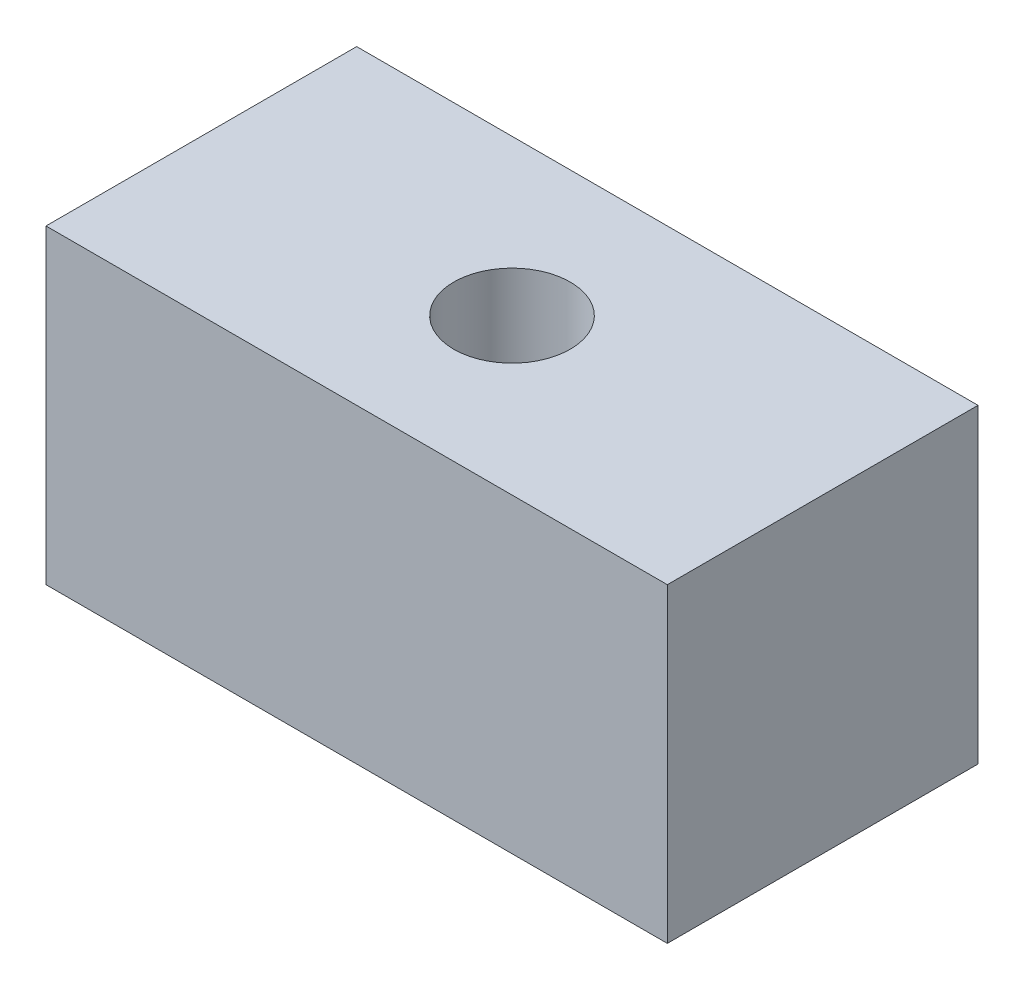
ISO-10303-21;
HEADER;
FILE_DESCRIPTION(('STEP AP214'),'2;1');
FILE_NAME('part.step','',(''),(''),'','','');
FILE_SCHEMA(('AUTOMOTIVE_DESIGN { 1 0 10303 214 1 1 1 1 }'));
ENDSEC;
DATA;
#1=APPLICATION_CONTEXT('core data for automotive mechanical design processes');
#2=APPLICATION_PROTOCOL_DEFINITION('international standard','automotive_design',2000,#1);
#3=PRODUCT_CONTEXT('',#1,'mechanical');
#4=PRODUCT('Part','Part','',(#3));
#5=PRODUCT_RELATED_PRODUCT_CATEGORY('part','',(#4));
#6=PRODUCT_DEFINITION_FORMATION('','',#4);
#7=PRODUCT_DEFINITION_CONTEXT('part definition',#1,'design');
#8=PRODUCT_DEFINITION('design','',#6,#7);
#9=PRODUCT_DEFINITION_SHAPE('','',#8);
#10=(LENGTH_UNIT() NAMED_UNIT(*) SI_UNIT(.MILLI.,.METRE.));
#11=(NAMED_UNIT(*) PLANE_ANGLE_UNIT() SI_UNIT($,.RADIAN.));
#12=(NAMED_UNIT(*) SI_UNIT($,.STERADIAN.) SOLID_ANGLE_UNIT());
#13=UNCERTAINTY_MEASURE_WITH_UNIT(LENGTH_MEASURE(1.E-05),#10,'distance_accuracy_value','');
#14=(GEOMETRIC_REPRESENTATION_CONTEXT(3) GLOBAL_UNCERTAINTY_ASSIGNED_CONTEXT((#13)) GLOBAL_UNIT_ASSIGNED_CONTEXT((#10,
#11,#12)) REPRESENTATION_CONTEXT('',''));
#15=CARTESIAN_POINT('',(0.,0.,0.));
#16=DIRECTION('',(0.,0.,1.));
#17=DIRECTION('',(1.,0.,0.));
#18=AXIS2_PLACEMENT_3D('',#15,#16,#17);
#19=CARTESIAN_POINT('',(0.,0.,50.8));
#20=DIRECTION('',(1.,0.,0.));
#21=DIRECTION('',(0.,0.,-1.));
#22=AXIS2_PLACEMENT_3D('',#19,#20,#21);
#23=PLANE('',#22);
#24=DIRECTION('',(0.,-1.,0.));
#25=VECTOR('',#24,1.);
#26=CARTESIAN_POINT('',(0.,0.,0.));
#27=LINE('',#26,#25);
#28=CARTESIAN_POINT('',(0.,50.8,0.));
#29=VERTEX_POINT('',#28);
#30=CARTESIAN_POINT('',(0.,0.,0.));
#31=VERTEX_POINT('',#30);
#32=EDGE_CURVE('E106',#29,#31,#27,.T.);
#33=ORIENTED_EDGE('',*,*,#32,.T.);
#34=DIRECTION('',(0.,0.,-1.));
#35=VECTOR('',#34,1.);
#36=CARTESIAN_POINT('',(0.,0.,50.8));
#37=LINE('',#36,#35);
#38=CARTESIAN_POINT('',(0.,0.,50.8));
#39=VERTEX_POINT('',#38);
#40=EDGE_CURVE('E11',#39,#31,#37,.T.);
#41=ORIENTED_EDGE('',*,*,#40,.F.);
#42=DIRECTION('',(0.,-1.,0.));
#43=VECTOR('',#42,1.);
#44=CARTESIAN_POINT('',(0.,0.,50.8));
#45=LINE('',#44,#43);
#46=CARTESIAN_POINT('',(0.,50.8,50.8));
#47=VERTEX_POINT('',#46);
#48=EDGE_CURVE('E90',#47,#39,#45,.T.);
#49=ORIENTED_EDGE('',*,*,#48,.F.);
#50=DIRECTION('',(0.,0.,-1.));
#51=VECTOR('',#50,1.);
#52=CARTESIAN_POINT('',(0.,50.8,50.8));
#53=LINE('',#52,#51);
#54=EDGE_CURVE('E102',#47,#29,#53,.T.);
#55=ORIENTED_EDGE('',*,*,#54,.T.);
#56=EDGE_LOOP('',(#33,#41,#49,#55));
#57=FACE_BOUND('',#56,.T.);
#58=ADVANCED_FACE('F38',(#57),#23,.F.);
#59=CARTESIAN_POINT('',(0.,0.,50.8));
#60=DIRECTION('',(0.,1.,0.));
#61=DIRECTION('',(0.,0.,1.));
#62=AXIS2_PLACEMENT_3D('',#59,#60,#61);
#63=PLANE('',#62);
#64=CARTESIAN_POINT('',(50.8,0.,25.4));
#65=DIRECTION('',(0.,1.,0.));
#66=DIRECTION('',(0.,0.,1.));
#67=AXIS2_PLACEMENT_3D('',#64,#65,#66);
#68=CIRCLE('',#67,9.525);
#69=CARTESIAN_POINT('',(50.8,0.,34.925));
#70=VERTEX_POINT('',#69);
#71=EDGE_CURVE('E110',#70,#70,#68,.T.);
#72=ORIENTED_EDGE('',*,*,#71,.T.);
#73=EDGE_LOOP('',(#72));
#74=FACE_BOUND('',#73,.T.);
#75=DIRECTION('',(1.,0.,0.));
#76=VECTOR('',#75,1.);
#77=CARTESIAN_POINT('',(0.,0.,0.));
#78=LINE('',#77,#76);
#79=CARTESIAN_POINT('',(101.6,0.,0.));
#80=VERTEX_POINT('',#79);
#81=EDGE_CURVE('E95',#31,#80,#78,.T.);
#82=ORIENTED_EDGE('',*,*,#81,.T.);
#83=DIRECTION('',(0.,0.,-1.));
#84=VECTOR('',#83,1.);
#85=CARTESIAN_POINT('',(101.6,0.,50.8));
#86=LINE('',#85,#84);
#87=CARTESIAN_POINT('',(101.6,0.,50.8));
#88=VERTEX_POINT('',#87);
#89=EDGE_CURVE('E47',#88,#80,#86,.T.);
#90=ORIENTED_EDGE('',*,*,#89,.F.);
#91=DIRECTION('',(1.,0.,0.));
#92=VECTOR('',#91,1.);
#93=CARTESIAN_POINT('',(0.,0.,50.8));
#94=LINE('',#93,#92);
#95=EDGE_CURVE('E85',#39,#88,#94,.T.);
#96=ORIENTED_EDGE('',*,*,#95,.F.);
#97=ORIENTED_EDGE('',*,*,#40,.T.);
#98=EDGE_LOOP('',(#82,#90,#96,#97));
#99=FACE_BOUND('',#98,.T.);
#100=ADVANCED_FACE('F94',(#74,#99),#63,.F.);
#101=CARTESIAN_POINT('',(101.6,0.,50.8));
#102=DIRECTION('',(-1.,0.,0.));
#103=DIRECTION('',(0.,0.,1.));
#104=AXIS2_PLACEMENT_3D('',#101,#102,#103);
#105=PLANE('',#104);
#106=DIRECTION('',(0.,1.,0.));
#107=VECTOR('',#106,1.);
#108=CARTESIAN_POINT('',(101.6,0.,0.));
#109=LINE('',#108,#107);
#110=CARTESIAN_POINT('',(101.6,50.8,0.));
#111=VERTEX_POINT('',#110);
#112=EDGE_CURVE('E72',#80,#111,#109,.T.);
#113=ORIENTED_EDGE('',*,*,#112,.T.);
#114=DIRECTION('',(0.,0.,-1.));
#115=VECTOR('',#114,1.);
#116=CARTESIAN_POINT('',(101.6,50.8,50.8));
#117=LINE('',#116,#115);
#118=CARTESIAN_POINT('',(101.6,50.8,50.8));
#119=VERTEX_POINT('',#118);
#120=EDGE_CURVE('E97',#119,#111,#117,.T.);
#121=ORIENTED_EDGE('',*,*,#120,.F.);
#122=DIRECTION('',(0.,1.,0.));
#123=VECTOR('',#122,1.);
#124=CARTESIAN_POINT('',(101.6,0.,50.8));
#125=LINE('',#124,#123);
#126=EDGE_CURVE('E88',#88,#119,#125,.T.);
#127=ORIENTED_EDGE('',*,*,#126,.F.);
#128=ORIENTED_EDGE('',*,*,#89,.T.);
#129=EDGE_LOOP('',(#113,#121,#127,#128));
#130=FACE_BOUND('',#129,.T.);
#131=ADVANCED_FACE('F98',(#130),#105,.F.);
#132=CARTESIAN_POINT('',(0.,50.8,50.8));
#133=DIRECTION('',(0.,-1.,0.));
#134=DIRECTION('',(0.,0.,-1.));
#135=AXIS2_PLACEMENT_3D('',#132,#133,#134);
#136=PLANE('',#135);
#137=CARTESIAN_POINT('',(50.8,50.8,25.4));
#138=DIRECTION('',(0.,1.,0.));
#139=DIRECTION('',(0.,0.,1.));
#140=AXIS2_PLACEMENT_3D('',#137,#138,#139);
#141=CIRCLE('',#140,9.525);
#142=CARTESIAN_POINT('',(50.8,50.8,34.925));
#143=VERTEX_POINT('',#142);
#144=EDGE_CURVE('E127',#143,#143,#141,.T.);
#145=ORIENTED_EDGE('',*,*,#144,.F.);
#146=EDGE_LOOP('',(#145));
#147=FACE_BOUND('',#146,.T.);
#148=DIRECTION('',(-1.,0.,0.));
#149=VECTOR('',#148,1.);
#150=CARTESIAN_POINT('',(0.,50.8,0.));
#151=LINE('',#150,#149);
#152=EDGE_CURVE('E78',#111,#29,#151,.T.);
#153=ORIENTED_EDGE('',*,*,#152,.T.);
#154=ORIENTED_EDGE('',*,*,#54,.F.);
#155=DIRECTION('',(-1.,0.,0.));
#156=VECTOR('',#155,1.);
#157=CARTESIAN_POINT('',(0.,50.8,50.8));
#158=LINE('',#157,#156);
#159=EDGE_CURVE('E55',#119,#47,#158,.T.);
#160=ORIENTED_EDGE('',*,*,#159,.F.);
#161=ORIENTED_EDGE('',*,*,#120,.T.);
#162=EDGE_LOOP('',(#153,#154,#160,#161));
#163=FACE_BOUND('',#162,.T.);
#164=ADVANCED_FACE('F120',(#147,#163),#136,.F.);
#165=CARTESIAN_POINT('',(0.,0.,50.8));
#166=DIRECTION('',(0.,0.,-1.));
#167=DIRECTION('',(-1.,0.,0.));
#168=AXIS2_PLACEMENT_3D('',#165,#166,#167);
#169=PLANE('',#168);
#170=ORIENTED_EDGE('',*,*,#48,.T.);
#171=ORIENTED_EDGE('',*,*,#95,.T.);
#172=ORIENTED_EDGE('',*,*,#126,.T.);
#173=ORIENTED_EDGE('',*,*,#159,.T.);
#174=EDGE_LOOP('',(#170,#171,#172,#173));
#175=FACE_BOUND('',#174,.T.);
#176=ADVANCED_FACE('F86',(#175),#169,.F.);
#177=CARTESIAN_POINT('',(0.,0.,0.));
#178=DIRECTION('',(0.,0.,-1.));
#179=DIRECTION('',(-1.,0.,0.));
#180=AXIS2_PLACEMENT_3D('',#177,#178,#179);
#181=PLANE('',#180);
#182=ORIENTED_EDGE('',*,*,#32,.F.);
#183=ORIENTED_EDGE('',*,*,#152,.F.);
#184=ORIENTED_EDGE('',*,*,#112,.F.);
#185=ORIENTED_EDGE('',*,*,#81,.F.);
#186=EDGE_LOOP('',(#182,#183,#184,#185));
#187=FACE_BOUND('',#186,.T.);
#188=ADVANCED_FACE('F123',(#187),#181,.T.);
#189=CARTESIAN_POINT('',(50.8,0.,25.4));
#190=DIRECTION('',(0.,1.,0.));
#191=DIRECTION('',(0.,0.,1.));
#192=AXIS2_PLACEMENT_3D('',#189,#190,#191);
#193=CYLINDRICAL_SURFACE('',#192,9.525);
#194=ORIENTED_EDGE('',*,*,#71,.F.);
#195=EDGE_LOOP('',(#194));
#196=FACE_BOUND('',#195,.T.);
#197=ORIENTED_EDGE('',*,*,#144,.T.);
#198=EDGE_LOOP('',(#197));
#199=FACE_BOUND('',#198,.T.);
#200=ADVANCED_FACE('F136',(#196,#199),#193,.F.);
#201=CLOSED_SHELL('',(#58,#100,#131,#164,#176,#188,#200));
#202=MANIFOLD_SOLID_BREP('B2',#201);
#203=ADVANCED_BREP_SHAPE_REPRESENTATION('',(#18,#202),#14);
#204=SHAPE_DEFINITION_REPRESENTATION(#9,#203);
ENDSEC;
END-ISO-10303-21;
